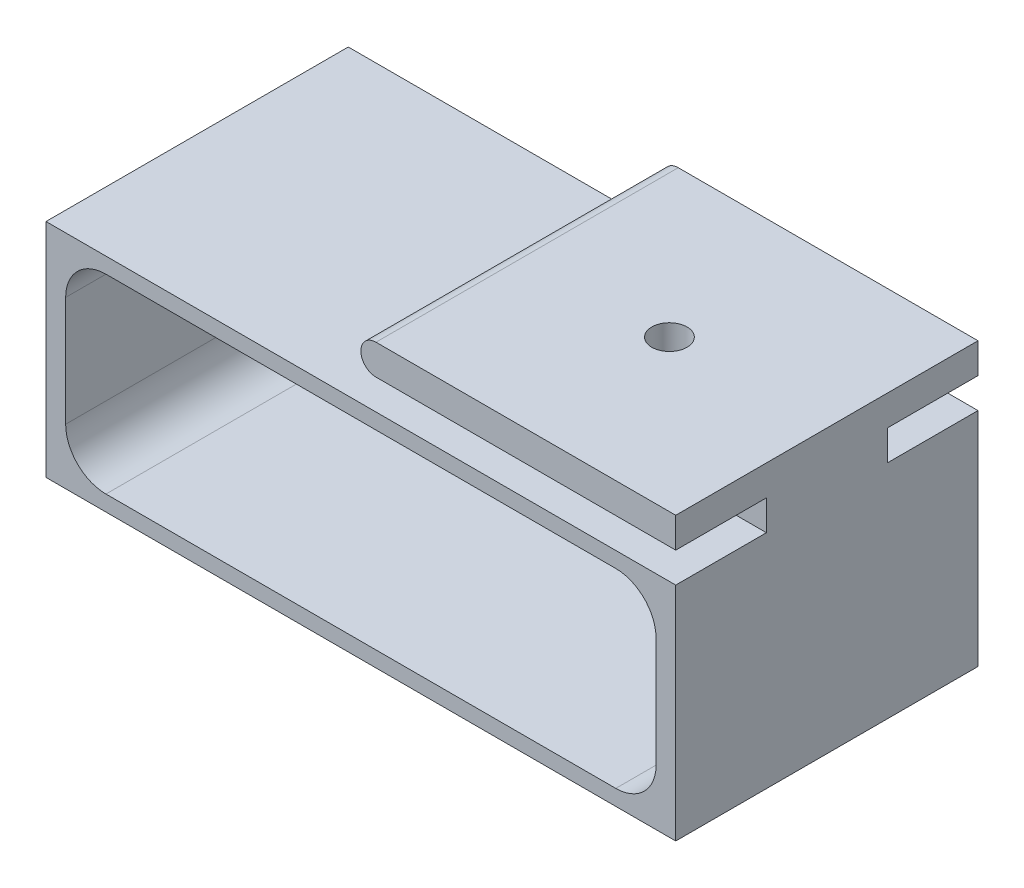
ISO-10303-21;
HEADER;
FILE_DESCRIPTION(('STEP AP214'),'2;1');
FILE_NAME('part.step','',(''),(''),'','','');
FILE_SCHEMA(('AUTOMOTIVE_DESIGN { 1 0 10303 214 1 1 1 1 }'));
ENDSEC;
DATA;
#1=APPLICATION_CONTEXT('core data for automotive mechanical design processes');
#2=APPLICATION_PROTOCOL_DEFINITION('international standard','automotive_design',2000,#1);
#3=PRODUCT_CONTEXT('',#1,'mechanical');
#4=PRODUCT('Part','Part','',(#3));
#5=PRODUCT_RELATED_PRODUCT_CATEGORY('part','',(#4));
#6=PRODUCT_DEFINITION_FORMATION('','',#4);
#7=PRODUCT_DEFINITION_CONTEXT('part definition',#1,'design');
#8=PRODUCT_DEFINITION('design','',#6,#7);
#9=PRODUCT_DEFINITION_SHAPE('','',#8);
#10=(LENGTH_UNIT() NAMED_UNIT(*) SI_UNIT(.MILLI.,.METRE.));
#11=(NAMED_UNIT(*) PLANE_ANGLE_UNIT() SI_UNIT($,.RADIAN.));
#12=(NAMED_UNIT(*) SI_UNIT($,.STERADIAN.) SOLID_ANGLE_UNIT());
#13=UNCERTAINTY_MEASURE_WITH_UNIT(LENGTH_MEASURE(1.E-05),#10,'distance_accuracy_value','');
#14=(GEOMETRIC_REPRESENTATION_CONTEXT(3) GLOBAL_UNCERTAINTY_ASSIGNED_CONTEXT((#13)) GLOBAL_UNIT_ASSIGNED_CONTEXT((#10,
#11,#12)) REPRESENTATION_CONTEXT('',''));
#15=CARTESIAN_POINT('',(0.,0.,0.));
#16=DIRECTION('',(0.,0.,1.));
#17=DIRECTION('',(1.,0.,0.));
#18=AXIS2_PLACEMENT_3D('',#15,#16,#17);
#19=CARTESIAN_POINT('',(0.,22.,15.));
#20=DIRECTION('',(0.,-1.,0.));
#21=DIRECTION('',(0.,0.,-1.));
#22=AXIS2_PLACEMENT_3D('',#19,#20,#21);
#23=PLANE('',#22);
#24=DIRECTION('',(-1.,0.,0.));
#25=VECTOR('',#24,1.);
#26=CARTESIAN_POINT('',(93.0941170815567,22.,-6.));
#27=LINE('',#26,#25);
#28=CARTESIAN_POINT('',(62.5,22.,-6.));
#29=VERTEX_POINT('',#28);
#30=CARTESIAN_POINT('',(31.25,22.,-6.));
#31=VERTEX_POINT('',#30);
#32=EDGE_CURVE('E246',#29,#31,#27,.T.);
#33=ORIENTED_EDGE('',*,*,#32,.F.);
#34=DIRECTION('',(0.,0.,-1.));
#35=VECTOR('',#34,1.);
#36=CARTESIAN_POINT('',(62.5,22.,15.));
#37=LINE('',#36,#35);
#38=CARTESIAN_POINT('',(62.5,22.,-15.));
#39=VERTEX_POINT('',#38);
#40=EDGE_CURVE('E317',#29,#39,#37,.T.);
#41=ORIENTED_EDGE('',*,*,#40,.T.);
#42=DIRECTION('',(-1.,0.,0.));
#43=VECTOR('',#42,1.);
#44=CARTESIAN_POINT('',(0.,22.,-15.));
#45=LINE('',#44,#43);
#46=CARTESIAN_POINT('',(0.,22.,-15.));
#47=VERTEX_POINT('',#46);
#48=EDGE_CURVE('E292',#39,#47,#45,.T.);
#49=ORIENTED_EDGE('',*,*,#48,.T.);
#50=DIRECTION('',(0.,0.,-1.));
#51=VECTOR('',#50,1.);
#52=CARTESIAN_POINT('',(0.,22.,15.));
#53=LINE('',#52,#51);
#54=CARTESIAN_POINT('',(0.,22.,15.));
#55=VERTEX_POINT('',#54);
#56=EDGE_CURVE('E301',#55,#47,#53,.T.);
#57=ORIENTED_EDGE('',*,*,#56,.F.);
#58=DIRECTION('',(-1.,0.,0.));
#59=VECTOR('',#58,1.);
#60=CARTESIAN_POINT('',(0.,22.,15.));
#61=LINE('',#60,#59);
#62=CARTESIAN_POINT('',(62.5,22.,15.));
#63=VERTEX_POINT('',#62);
#64=EDGE_CURVE('E298',#63,#55,#61,.T.);
#65=ORIENTED_EDGE('',*,*,#64,.F.);
#66=CARTESIAN_POINT('',(62.5,22.,6.));
#67=VERTEX_POINT('',#66);
#68=EDGE_CURVE('E221',#63,#67,#37,.T.);
#69=ORIENTED_EDGE('',*,*,#68,.T.);
#70=DIRECTION('',(-1.,0.,0.));
#71=VECTOR('',#70,1.);
#72=CARTESIAN_POINT('',(93.0941170815567,22.,6.));
#73=LINE('',#72,#71);
#74=CARTESIAN_POINT('',(31.25,22.,6.));
#75=VERTEX_POINT('',#74);
#76=EDGE_CURVE('E200',#67,#75,#73,.T.);
#77=ORIENTED_EDGE('',*,*,#76,.T.);
#78=DIRECTION('',(0.,0.,-1.));
#79=VECTOR('',#78,1.);
#80=CARTESIAN_POINT('',(31.25,22.,-6.));
#81=LINE('',#80,#79);
#82=EDGE_CURVE('E211',#75,#31,#81,.T.);
#83=ORIENTED_EDGE('',*,*,#82,.T.);
#84=EDGE_LOOP('',(#33,#41,#49,#57,#65,#69,#77,#83));
#85=FACE_BOUND('',#84,.T.);
#86=ADVANCED_FACE('F41',(#85),#23,.F.);
#87=CARTESIAN_POINT('',(0.,0.,15.));
#88=DIRECTION('',(0.,0.,-1.));
#89=DIRECTION('',(-1.,0.,0.));
#90=AXIS2_PLACEMENT_3D('',#87,#88,#89);
#91=PLANE('',#90);
#92=DIRECTION('',(0.,-1.,0.));
#93=VECTOR('',#92,1.);
#94=CARTESIAN_POINT('',(0.,0.,15.));
#95=LINE('',#94,#93);
#96=CARTESIAN_POINT('',(0.,0.,15.));
#97=VERTEX_POINT('',#96);
#98=EDGE_CURVE('E287',#55,#97,#95,.T.);
#99=ORIENTED_EDGE('',*,*,#98,.T.);
#100=DIRECTION('',(1.,0.,0.));
#101=VECTOR('',#100,1.);
#102=CARTESIAN_POINT('',(0.,0.,15.));
#103=LINE('',#102,#101);
#104=CARTESIAN_POINT('',(62.5,0.,15.));
#105=VERTEX_POINT('',#104);
#106=EDGE_CURVE('E291',#97,#105,#103,.T.);
#107=ORIENTED_EDGE('',*,*,#106,.T.);
#108=DIRECTION('',(0.,1.,0.));
#109=VECTOR('',#108,1.);
#110=CARTESIAN_POINT('',(62.5,0.,15.));
#111=LINE('',#110,#109);
#112=EDGE_CURVE('E295',#105,#63,#111,.T.);
#113=ORIENTED_EDGE('',*,*,#112,.T.);
#114=ORIENTED_EDGE('',*,*,#64,.T.);
#115=EDGE_LOOP('',(#99,#107,#113,#114));
#116=FACE_BOUND('',#115,.T.);
#117=DIRECTION('',(0.,-1.,0.));
#118=VECTOR('',#117,1.);
#119=CARTESIAN_POINT('',(1.95,1.55,15.));
#120=LINE('',#119,#118);
#121=CARTESIAN_POINT('',(1.95,16.45,15.));
#122=VERTEX_POINT('',#121);
#123=CARTESIAN_POINT('',(1.95,5.55,15.));
#124=VERTEX_POINT('',#123);
#125=EDGE_CURVE('E253',#122,#124,#120,.T.);
#126=ORIENTED_EDGE('',*,*,#125,.F.);
#127=CARTESIAN_POINT('',(5.95,16.45,15.));
#128=DIRECTION('',(0.,0.,-1.));
#129=DIRECTION('',(-1.,0.,0.));
#130=AXIS2_PLACEMENT_3D('',#127,#128,#129);
#131=CIRCLE('',#130,4.);
#132=CARTESIAN_POINT('',(5.95,20.45,15.));
#133=VERTEX_POINT('',#132);
#134=EDGE_CURVE('E365',#122,#133,#131,.T.);
#135=ORIENTED_EDGE('',*,*,#134,.T.);
#136=DIRECTION('',(-1.,0.,0.));
#137=VECTOR('',#136,1.);
#138=CARTESIAN_POINT('',(1.95,20.45,15.));
#139=LINE('',#138,#137);
#140=CARTESIAN_POINT('',(56.55,20.45,15.));
#141=VERTEX_POINT('',#140);
#142=EDGE_CURVE('E266',#141,#133,#139,.T.);
#143=ORIENTED_EDGE('',*,*,#142,.F.);
#144=CARTESIAN_POINT('',(56.55,16.45,15.));
#145=DIRECTION('',(0.,0.,-1.));
#146=DIRECTION('',(-1.,0.,0.));
#147=AXIS2_PLACEMENT_3D('',#144,#145,#146);
#148=CIRCLE('',#147,4.);
#149=CARTESIAN_POINT('',(60.55,16.45,15.));
#150=VERTEX_POINT('',#149);
#151=EDGE_CURVE('E359',#141,#150,#148,.T.);
#152=ORIENTED_EDGE('',*,*,#151,.T.);
#153=DIRECTION('',(0.,1.,0.));
#154=VECTOR('',#153,1.);
#155=CARTESIAN_POINT('',(60.55,1.55,15.));
#156=LINE('',#155,#154);
#157=CARTESIAN_POINT('',(60.55,5.55,15.));
#158=VERTEX_POINT('',#157);
#159=EDGE_CURVE('E262',#158,#150,#156,.T.);
#160=ORIENTED_EDGE('',*,*,#159,.F.);
#161=CARTESIAN_POINT('',(56.55,5.55,15.));
#162=DIRECTION('',(0.,0.,-1.));
#163=DIRECTION('',(-1.,0.,0.));
#164=AXIS2_PLACEMENT_3D('',#161,#162,#163);
#165=CIRCLE('',#164,4.);
#166=CARTESIAN_POINT('',(56.55,1.55,15.));
#167=VERTEX_POINT('',#166);
#168=EDGE_CURVE('E377',#158,#167,#165,.T.);
#169=ORIENTED_EDGE('',*,*,#168,.T.);
#170=DIRECTION('',(1.,0.,0.));
#171=VECTOR('',#170,1.);
#172=CARTESIAN_POINT('',(1.95,1.55,15.));
#173=LINE('',#172,#171);
#174=CARTESIAN_POINT('',(5.95,1.55,15.));
#175=VERTEX_POINT('',#174);
#176=EDGE_CURVE('E257',#175,#167,#173,.T.);
#177=ORIENTED_EDGE('',*,*,#176,.F.);
#178=CARTESIAN_POINT('',(5.95,5.55,15.));
#179=DIRECTION('',(0.,0.,-1.));
#180=DIRECTION('',(-1.,0.,0.));
#181=AXIS2_PLACEMENT_3D('',#178,#179,#180);
#182=CIRCLE('',#181,4.);
#183=EDGE_CURVE('E371',#175,#124,#182,.T.);
#184=ORIENTED_EDGE('',*,*,#183,.T.);
#185=EDGE_LOOP('',(#126,#135,#143,#152,#160,#169,#177,#184));
#186=FACE_BOUND('',#185,.T.);
#187=ADVANCED_FACE('F477',(#116,#186),#91,.F.);
#188=CARTESIAN_POINT('',(0.,0.,-15.));
#189=DIRECTION('',(0.,0.,-1.));
#190=DIRECTION('',(-1.,0.,0.));
#191=AXIS2_PLACEMENT_3D('',#188,#189,#190);
#192=PLANE('',#191);
#193=DIRECTION('',(0.,-1.,0.));
#194=VECTOR('',#193,1.);
#195=CARTESIAN_POINT('',(0.,0.,-15.));
#196=LINE('',#195,#194);
#197=CARTESIAN_POINT('',(0.,0.,-15.));
#198=VERTEX_POINT('',#197);
#199=EDGE_CURVE('E270',#47,#198,#196,.T.);
#200=ORIENTED_EDGE('',*,*,#199,.F.);
#201=ORIENTED_EDGE('',*,*,#48,.F.);
#202=DIRECTION('',(0.,1.,0.));
#203=VECTOR('',#202,1.);
#204=CARTESIAN_POINT('',(62.5,0.,-15.));
#205=LINE('',#204,#203);
#206=CARTESIAN_POINT('',(62.5,0.,-15.));
#207=VERTEX_POINT('',#206);
#208=EDGE_CURVE('E308',#207,#39,#205,.T.);
#209=ORIENTED_EDGE('',*,*,#208,.F.);
#210=DIRECTION('',(1.,0.,0.));
#211=VECTOR('',#210,1.);
#212=CARTESIAN_POINT('',(0.,0.,-15.));
#213=LINE('',#212,#211);
#214=EDGE_CURVE('E305',#198,#207,#213,.T.);
#215=ORIENTED_EDGE('',*,*,#214,.F.);
#216=EDGE_LOOP('',(#200,#201,#209,#215));
#217=FACE_BOUND('',#216,.T.);
#218=DIRECTION('',(0.,1.,0.));
#219=VECTOR('',#218,1.);
#220=CARTESIAN_POINT('',(60.55,1.55,-15.));
#221=LINE('',#220,#219);
#222=CARTESIAN_POINT('',(60.55,5.55,-15.));
#223=VERTEX_POINT('',#222);
#224=CARTESIAN_POINT('',(60.55,16.45,-15.));
#225=VERTEX_POINT('',#224);
#226=EDGE_CURVE('E280',#223,#225,#221,.T.);
#227=ORIENTED_EDGE('',*,*,#226,.T.);
#228=CARTESIAN_POINT('',(56.55,16.45,-15.));
#229=DIRECTION('',(0.,0.,-1.));
#230=DIRECTION('',(-1.,0.,0.));
#231=AXIS2_PLACEMENT_3D('',#228,#229,#230);
#232=CIRCLE('',#231,4.);
#233=CARTESIAN_POINT('',(56.55,20.45,-15.));
#234=VERTEX_POINT('',#233);
#235=EDGE_CURVE('E356',#225,#234,#232,.F.);
#236=ORIENTED_EDGE('',*,*,#235,.T.);
#237=DIRECTION('',(-1.,0.,0.));
#238=VECTOR('',#237,1.);
#239=CARTESIAN_POINT('',(1.95,20.45,-15.));
#240=LINE('',#239,#238);
#241=CARTESIAN_POINT('',(5.95,20.45,-15.));
#242=VERTEX_POINT('',#241);
#243=EDGE_CURVE('E258',#234,#242,#240,.T.);
#244=ORIENTED_EDGE('',*,*,#243,.T.);
#245=CARTESIAN_POINT('',(5.95,16.45,-15.));
#246=DIRECTION('',(0.,0.,-1.));
#247=DIRECTION('',(-1.,0.,0.));
#248=AXIS2_PLACEMENT_3D('',#245,#246,#247);
#249=CIRCLE('',#248,4.);
#250=CARTESIAN_POINT('',(1.95,16.45,-15.));
#251=VERTEX_POINT('',#250);
#252=EDGE_CURVE('E362',#242,#251,#249,.F.);
#253=ORIENTED_EDGE('',*,*,#252,.T.);
#254=DIRECTION('',(0.,-1.,0.));
#255=VECTOR('',#254,1.);
#256=CARTESIAN_POINT('',(1.95,1.55,-15.));
#257=LINE('',#256,#255);
#258=CARTESIAN_POINT('',(1.95,5.55,-15.));
#259=VERTEX_POINT('',#258);
#260=EDGE_CURVE('E271',#251,#259,#257,.T.);
#261=ORIENTED_EDGE('',*,*,#260,.T.);
#262=CARTESIAN_POINT('',(5.95,5.55,-15.));
#263=DIRECTION('',(0.,0.,-1.));
#264=DIRECTION('',(-1.,0.,0.));
#265=AXIS2_PLACEMENT_3D('',#262,#263,#264);
#266=CIRCLE('',#265,4.);
#267=CARTESIAN_POINT('',(5.95,1.55,-15.));
#268=VERTEX_POINT('',#267);
#269=EDGE_CURVE('E368',#259,#268,#266,.F.);
#270=ORIENTED_EDGE('',*,*,#269,.T.);
#271=DIRECTION('',(1.,0.,0.));
#272=VECTOR('',#271,1.);
#273=CARTESIAN_POINT('',(1.95,1.55,-15.));
#274=LINE('',#273,#272);
#275=CARTESIAN_POINT('',(56.55,1.55,-15.));
#276=VERTEX_POINT('',#275);
#277=EDGE_CURVE('E275',#268,#276,#274,.T.);
#278=ORIENTED_EDGE('',*,*,#277,.T.);
#279=CARTESIAN_POINT('',(56.55,5.55,-15.));
#280=DIRECTION('',(0.,0.,-1.));
#281=DIRECTION('',(-1.,0.,0.));
#282=AXIS2_PLACEMENT_3D('',#279,#280,#281);
#283=CIRCLE('',#282,4.);
#284=EDGE_CURVE('E374',#276,#223,#283,.F.);
#285=ORIENTED_EDGE('',*,*,#284,.T.);
#286=EDGE_LOOP('',(#227,#236,#244,#253,#261,#270,#278,#285));
#287=FACE_BOUND('',#286,.T.);
#288=ADVANCED_FACE('F470',(#217,#287),#192,.T.);
#289=CARTESIAN_POINT('',(0.,0.,15.));
#290=DIRECTION('',(1.,0.,0.));
#291=DIRECTION('',(0.,0.,-1.));
#292=AXIS2_PLACEMENT_3D('',#289,#290,#291);
#293=PLANE('',#292);
#294=ORIENTED_EDGE('',*,*,#199,.T.);
#295=DIRECTION('',(0.,0.,-1.));
#296=VECTOR('',#295,1.);
#297=CARTESIAN_POINT('',(0.,0.,15.));
#298=LINE('',#297,#296);
#299=EDGE_CURVE('E324',#97,#198,#298,.T.);
#300=ORIENTED_EDGE('',*,*,#299,.F.);
#301=ORIENTED_EDGE('',*,*,#98,.F.);
#302=ORIENTED_EDGE('',*,*,#56,.T.);
#303=EDGE_LOOP('',(#294,#300,#301,#302));
#304=FACE_BOUND('',#303,.T.);
#305=ADVANCED_FACE('F474',(#304),#293,.F.);
#306=CARTESIAN_POINT('',(0.,0.,15.));
#307=DIRECTION('',(0.,1.,0.));
#308=DIRECTION('',(-1.,0.,0.));
#309=AXIS2_PLACEMENT_3D('',#306,#307,#308);
#310=PLANE('',#309);
#311=ORIENTED_EDGE('',*,*,#214,.T.);
#312=DIRECTION('',(0.,0.,-1.));
#313=VECTOR('',#312,1.);
#314=CARTESIAN_POINT('',(62.5,0.,15.));
#315=LINE('',#314,#313);
#316=EDGE_CURVE('E320',#105,#207,#315,.T.);
#317=ORIENTED_EDGE('',*,*,#316,.F.);
#318=ORIENTED_EDGE('',*,*,#106,.F.);
#319=ORIENTED_EDGE('',*,*,#299,.T.);
#320=EDGE_LOOP('',(#311,#317,#318,#319));
#321=FACE_BOUND('',#320,.T.);
#322=ADVANCED_FACE('F506',(#321),#310,.F.);
#323=CARTESIAN_POINT('',(62.5,0.,15.));
#324=DIRECTION('',(-1.,0.,0.));
#325=DIRECTION('',(0.,0.,1.));
#326=AXIS2_PLACEMENT_3D('',#323,#324,#325);
#327=PLANE('',#326);
#328=ORIENTED_EDGE('',*,*,#208,.T.);
#329=ORIENTED_EDGE('',*,*,#40,.F.);
#330=DIRECTION('',(0.,-1.,0.));
#331=VECTOR('',#330,1.);
#332=CARTESIAN_POINT('',(62.5,25.,-6.));
#333=LINE('',#332,#331);
#334=CARTESIAN_POINT('',(62.5,25.,-6.));
#335=VERTEX_POINT('',#334);
#336=EDGE_CURVE('E276',#335,#29,#333,.T.);
#337=ORIENTED_EDGE('',*,*,#336,.F.);
#338=DIRECTION('',(0.,0.,1.));
#339=VECTOR('',#338,1.);
#340=CARTESIAN_POINT('',(62.5,25.,-15.));
#341=LINE('',#340,#339);
#342=CARTESIAN_POINT('',(62.5,25.,-15.));
#343=VERTEX_POINT('',#342);
#344=EDGE_CURVE('E440',#343,#335,#341,.T.);
#345=ORIENTED_EDGE('',*,*,#344,.F.);
#346=DIRECTION('',(0.,-1.,0.));
#347=VECTOR('',#346,1.);
#348=CARTESIAN_POINT('',(62.5,28.,-15.));
#349=LINE('',#348,#347);
#350=CARTESIAN_POINT('',(62.5,28.,-15.));
#351=VERTEX_POINT('',#350);
#352=EDGE_CURVE('E436',#351,#343,#349,.T.);
#353=ORIENTED_EDGE('',*,*,#352,.F.);
#354=DIRECTION('',(0.,0.,-1.));
#355=VECTOR('',#354,1.);
#356=CARTESIAN_POINT('',(62.5,28.,15.));
#357=LINE('',#356,#355);
#358=CARTESIAN_POINT('',(62.5,28.,15.));
#359=VERTEX_POINT('',#358);
#360=EDGE_CURVE('E432',#359,#351,#357,.T.);
#361=ORIENTED_EDGE('',*,*,#360,.F.);
#362=DIRECTION('',(0.,1.,0.));
#363=VECTOR('',#362,1.);
#364=CARTESIAN_POINT('',(62.5,25.,15.));
#365=LINE('',#364,#363);
#366=CARTESIAN_POINT('',(62.5,25.,15.));
#367=VERTEX_POINT('',#366);
#368=EDGE_CURVE('E428',#367,#359,#365,.T.);
#369=ORIENTED_EDGE('',*,*,#368,.F.);
#370=DIRECTION('',(0.,0.,1.));
#371=VECTOR('',#370,1.);
#372=CARTESIAN_POINT('',(62.5,25.,6.));
#373=LINE('',#372,#371);
#374=CARTESIAN_POINT('',(62.5,25.,6.));
#375=VERTEX_POINT('',#374);
#376=EDGE_CURVE('E252',#375,#367,#373,.T.);
#377=ORIENTED_EDGE('',*,*,#376,.F.);
#378=DIRECTION('',(0.,1.,0.));
#379=VECTOR('',#378,1.);
#380=CARTESIAN_POINT('',(62.5,22.,6.));
#381=LINE('',#380,#379);
#382=EDGE_CURVE('E249',#67,#375,#381,.T.);
#383=ORIENTED_EDGE('',*,*,#382,.F.);
#384=ORIENTED_EDGE('',*,*,#68,.F.);
#385=ORIENTED_EDGE('',*,*,#112,.F.);
#386=ORIENTED_EDGE('',*,*,#316,.T.);
#387=EDGE_LOOP('',(#328,#329,#337,#345,#353,#361,#369,#377,#383,#384,#385,#386));
#388=FACE_BOUND('',#387,.T.);
#389=ADVANCED_FACE('F460',(#388),#327,.F.);
#390=CARTESIAN_POINT('',(1.95,1.55,15.));
#391=DIRECTION('',(1.,0.,0.));
#392=DIRECTION('',(0.,0.,-1.));
#393=AXIS2_PLACEMENT_3D('',#390,#391,#392);
#394=PLANE('',#393);
#395=ORIENTED_EDGE('',*,*,#260,.F.);
#396=DIRECTION('',(0.,0.,-1.));
#397=VECTOR('',#396,1.);
#398=CARTESIAN_POINT('',(1.95,16.45,15.));
#399=LINE('',#398,#397);
#400=EDGE_CURVE('E346',#251,#122,#399,.F.);
#401=ORIENTED_EDGE('',*,*,#400,.T.);
#402=ORIENTED_EDGE('',*,*,#125,.T.);
#403=DIRECTION('',(0.,0.,-1.));
#404=VECTOR('',#403,1.);
#405=CARTESIAN_POINT('',(1.95,5.55,-15.));
#406=LINE('',#405,#404);
#407=EDGE_CURVE('E342',#124,#259,#406,.T.);
#408=ORIENTED_EDGE('',*,*,#407,.T.);
#409=EDGE_LOOP('',(#395,#401,#402,#408));
#410=FACE_BOUND('',#409,.T.);
#411=ADVANCED_FACE('F505',(#410),#394,.T.);
#412=CARTESIAN_POINT('',(1.95,1.55,15.));
#413=DIRECTION('',(0.,1.,0.));
#414=DIRECTION('',(0.,0.,1.));
#415=AXIS2_PLACEMENT_3D('',#412,#413,#414);
#416=PLANE('',#415);
#417=ORIENTED_EDGE('',*,*,#277,.F.);
#418=DIRECTION('',(0.,0.,-1.));
#419=VECTOR('',#418,1.);
#420=CARTESIAN_POINT('',(5.95,1.55,15.));
#421=LINE('',#420,#419);
#422=EDGE_CURVE('E353',#268,#175,#421,.F.);
#423=ORIENTED_EDGE('',*,*,#422,.T.);
#424=ORIENTED_EDGE('',*,*,#176,.T.);
#425=DIRECTION('',(0.,0.,-1.));
#426=VECTOR('',#425,1.);
#427=CARTESIAN_POINT('',(56.55,1.55,-15.));
#428=LINE('',#427,#426);
#429=EDGE_CURVE('E349',#167,#276,#428,.T.);
#430=ORIENTED_EDGE('',*,*,#429,.T.);
#431=EDGE_LOOP('',(#417,#423,#424,#430));
#432=FACE_BOUND('',#431,.T.);
#433=ADVANCED_FACE('F637',(#432),#416,.T.);
#434=CARTESIAN_POINT('',(60.55,1.55,15.));
#435=DIRECTION('',(-1.,0.,0.));
#436=DIRECTION('',(0.,0.,1.));
#437=AXIS2_PLACEMENT_3D('',#434,#435,#436);
#438=PLANE('',#437);
#439=ORIENTED_EDGE('',*,*,#159,.T.);
#440=DIRECTION('',(0.,0.,-1.));
#441=VECTOR('',#440,1.);
#442=CARTESIAN_POINT('',(60.55,16.45,-15.));
#443=LINE('',#442,#441);
#444=EDGE_CURVE('E331',#150,#225,#443,.T.);
#445=ORIENTED_EDGE('',*,*,#444,.T.);
#446=ORIENTED_EDGE('',*,*,#226,.F.);
#447=DIRECTION('',(0.,0.,-1.));
#448=VECTOR('',#447,1.);
#449=CARTESIAN_POINT('',(60.55,5.55,15.));
#450=LINE('',#449,#448);
#451=EDGE_CURVE('E328',#223,#158,#450,.F.);
#452=ORIENTED_EDGE('',*,*,#451,.T.);
#453=EDGE_LOOP('',(#439,#445,#446,#452));
#454=FACE_BOUND('',#453,.T.);
#455=ADVANCED_FACE('F629',(#454),#438,.T.);
#456=CARTESIAN_POINT('',(1.95,20.45,15.));
#457=DIRECTION('',(0.,-1.,0.));
#458=DIRECTION('',(0.,0.,-1.));
#459=AXIS2_PLACEMENT_3D('',#456,#457,#458);
#460=PLANE('',#459);
#461=ORIENTED_EDGE('',*,*,#243,.F.);
#462=DIRECTION('',(0.,0.,-1.));
#463=VECTOR('',#462,1.);
#464=CARTESIAN_POINT('',(56.55,20.45,15.));
#465=LINE('',#464,#463);
#466=EDGE_CURVE('E339',#234,#141,#465,.F.);
#467=ORIENTED_EDGE('',*,*,#466,.T.);
#468=ORIENTED_EDGE('',*,*,#142,.T.);
#469=DIRECTION('',(0.,0.,-1.));
#470=VECTOR('',#469,1.);
#471=CARTESIAN_POINT('',(5.95,20.45,-15.));
#472=LINE('',#471,#470);
#473=EDGE_CURVE('E335',#133,#242,#472,.T.);
#474=ORIENTED_EDGE('',*,*,#473,.T.);
#475=EDGE_LOOP('',(#461,#467,#468,#474));
#476=FACE_BOUND('',#475,.T.);
#477=ADVANCED_FACE('F620',(#476),#460,.T.);
#478=CARTESIAN_POINT('',(31.25,0.,0.));
#479=DIRECTION('',(-1.,0.,0.));
#480=DIRECTION('',(0.,0.,1.));
#481=AXIS2_PLACEMENT_3D('',#478,#479,#480);
#482=PLANE('',#481);
#483=DIRECTION('',(0.,0.,1.));
#484=VECTOR('',#483,1.);
#485=CARTESIAN_POINT('',(31.25,26.5,-15.));
#486=LINE('',#485,#484);
#487=CARTESIAN_POINT('',(31.25,26.5,6.));
#488=VERTEX_POINT('',#487);
#489=CARTESIAN_POINT('',(31.25,26.5,-6.));
#490=VERTEX_POINT('',#489);
#491=EDGE_CURVE('E390',#488,#490,#486,.F.);
#492=ORIENTED_EDGE('',*,*,#491,.T.);
#493=DIRECTION('',(0.,1.,0.));
#494=VECTOR('',#493,1.);
#495=CARTESIAN_POINT('',(31.25,25.,-6.));
#496=LINE('',#495,#494);
#497=EDGE_CURVE('E208',#31,#490,#496,.T.);
#498=ORIENTED_EDGE('',*,*,#497,.F.);
#499=ORIENTED_EDGE('',*,*,#82,.F.);
#500=DIRECTION('',(0.,-1.,0.));
#501=VECTOR('',#500,1.);
#502=CARTESIAN_POINT('',(31.25,22.,6.));
#503=LINE('',#502,#501);
#504=EDGE_CURVE('E195',#488,#75,#503,.T.);
#505=ORIENTED_EDGE('',*,*,#504,.F.);
#506=EDGE_LOOP('',(#492,#498,#499,#505));
#507=FACE_BOUND('',#506,.T.);
#508=ADVANCED_FACE('F212',(#507),#482,.T.);
#509=CARTESIAN_POINT('',(93.0941170815567,22.,6.));
#510=DIRECTION('',(0.,0.,-1.));
#511=DIRECTION('',(-1.,0.,0.));
#512=AXIS2_PLACEMENT_3D('',#509,#510,#511);
#513=PLANE('',#512);
#514=ORIENTED_EDGE('',*,*,#76,.F.);
#515=ORIENTED_EDGE('',*,*,#382,.T.);
#516=DIRECTION('',(-1.,0.,0.));
#517=VECTOR('',#516,1.);
#518=CARTESIAN_POINT('',(93.0941170815567,25.,6.));
#519=LINE('',#518,#517);
#520=CARTESIAN_POINT('',(32.75,25.,6.));
#521=VERTEX_POINT('',#520);
#522=EDGE_CURVE('E223',#375,#521,#519,.T.);
#523=ORIENTED_EDGE('',*,*,#522,.T.);
#524=CARTESIAN_POINT('',(32.75,26.5,6.));
#525=DIRECTION('',(0.,0.,-1.));
#526=DIRECTION('',(-1.,0.,0.));
#527=AXIS2_PLACEMENT_3D('',#524,#525,#526);
#528=CIRCLE('',#527,1.5);
#529=EDGE_CURVE('E11',#521,#488,#528,.T.);
#530=ORIENTED_EDGE('',*,*,#529,.T.);
#531=ORIENTED_EDGE('',*,*,#504,.T.);
#532=EDGE_LOOP('',(#514,#515,#523,#530,#531));
#533=FACE_BOUND('',#532,.T.);
#534=ADVANCED_FACE('F197',(#533),#513,.F.);
#535=CARTESIAN_POINT('',(93.0941170815567,25.,6.));
#536=DIRECTION('',(0.,1.,0.));
#537=DIRECTION('',(0.,0.,1.));
#538=AXIS2_PLACEMENT_3D('',#535,#536,#537);
#539=PLANE('',#538);
#540=DIRECTION('',(-1.,0.,0.));
#541=VECTOR('',#540,1.);
#542=CARTESIAN_POINT('',(93.0941170815567,25.,15.));
#543=LINE('',#542,#541);
#544=CARTESIAN_POINT('',(32.75,25.,15.));
#545=VERTEX_POINT('',#544);
#546=EDGE_CURVE('E226',#367,#545,#543,.T.);
#547=ORIENTED_EDGE('',*,*,#546,.T.);
#548=DIRECTION('',(0.,0.,-1.));
#549=VECTOR('',#548,1.);
#550=CARTESIAN_POINT('',(32.75,25.,6.));
#551=LINE('',#550,#549);
#552=EDGE_CURVE('E393',#545,#521,#551,.T.);
#553=ORIENTED_EDGE('',*,*,#552,.T.);
#554=ORIENTED_EDGE('',*,*,#522,.F.);
#555=ORIENTED_EDGE('',*,*,#376,.T.);
#556=EDGE_LOOP('',(#547,#553,#554,#555));
#557=FACE_BOUND('',#556,.T.);
#558=ADVANCED_FACE('F483',(#557),#539,.F.);
#559=CARTESIAN_POINT('',(93.0941170815567,25.,15.));
#560=DIRECTION('',(0.,0.,-1.));
#561=DIRECTION('',(-1.,0.,0.));
#562=AXIS2_PLACEMENT_3D('',#559,#560,#561);
#563=PLANE('',#562);
#564=CARTESIAN_POINT('',(32.75,26.5,15.));
#565=DIRECTION('',(0.,0.,-1.));
#566=DIRECTION('',(-1.,0.,0.));
#567=AXIS2_PLACEMENT_3D('',#564,#565,#566);
#568=CIRCLE('',#567,1.5);
#569=CARTESIAN_POINT('',(32.75,28.,15.));
#570=VERTEX_POINT('',#569);
#571=CARTESIAN_POINT('',(31.25,26.5,15.));
#572=VERTEX_POINT('',#571);
#573=EDGE_CURVE('E396',#570,#572,#568,.F.);
#574=ORIENTED_EDGE('',*,*,#573,.T.);
#575=CARTESIAN_POINT('',(32.75,26.5,15.));
#576=DIRECTION('',(0.,0.,-1.));
#577=DIRECTION('',(-1.,0.,0.));
#578=AXIS2_PLACEMENT_3D('',#575,#576,#577);
#579=CIRCLE('',#578,1.5);
#580=EDGE_CURVE('E67',#572,#545,#579,.F.);
#581=ORIENTED_EDGE('',*,*,#580,.T.);
#582=ORIENTED_EDGE('',*,*,#546,.F.);
#583=ORIENTED_EDGE('',*,*,#368,.T.);
#584=DIRECTION('',(-1.,0.,0.));
#585=VECTOR('',#584,1.);
#586=CARTESIAN_POINT('',(93.0941170815567,28.,15.));
#587=LINE('',#586,#585);
#588=EDGE_CURVE('E232',#359,#570,#587,.T.);
#589=ORIENTED_EDGE('',*,*,#588,.T.);
#590=EDGE_LOOP('',(#574,#581,#582,#583,#589));
#591=FACE_BOUND('',#590,.T.);
#592=ADVANCED_FACE('F484',(#591),#563,.F.);
#593=CARTESIAN_POINT('',(93.0941170815567,28.,15.));
#594=DIRECTION('',(0.,-1.,0.));
#595=DIRECTION('',(0.,0.,-1.));
#596=AXIS2_PLACEMENT_3D('',#593,#594,#595);
#597=PLANE('',#596);
#598=CARTESIAN_POINT('',(46.875,28.,0.));
#599=DIRECTION('',(0.,1.,0.));
#600=DIRECTION('',(0.,0.,1.));
#601=AXIS2_PLACEMENT_3D('',#598,#599,#600);
#602=CIRCLE('',#601,1.75);
#603=CARTESIAN_POINT('',(46.875,28.,1.75));
#604=VERTEX_POINT('',#603);
#605=EDGE_CURVE('E412',#604,#604,#602,.T.);
#606=ORIENTED_EDGE('',*,*,#605,.F.);
#607=EDGE_LOOP('',(#606));
#608=FACE_BOUND('',#607,.T.);
#609=DIRECTION('',(-1.,0.,0.));
#610=VECTOR('',#609,1.);
#611=CARTESIAN_POINT('',(93.0941170815567,28.,-15.));
#612=LINE('',#611,#610);
#613=CARTESIAN_POINT('',(32.75,28.,-15.));
#614=VERTEX_POINT('',#613);
#615=EDGE_CURVE('E235',#351,#614,#612,.T.);
#616=ORIENTED_EDGE('',*,*,#615,.T.);
#617=DIRECTION('',(0.,0.,1.));
#618=VECTOR('',#617,1.);
#619=CARTESIAN_POINT('',(32.75,28.,15.));
#620=LINE('',#619,#618);
#621=EDGE_CURVE('E59',#614,#570,#620,.T.);
#622=ORIENTED_EDGE('',*,*,#621,.T.);
#623=ORIENTED_EDGE('',*,*,#588,.F.);
#624=ORIENTED_EDGE('',*,*,#360,.T.);
#625=EDGE_LOOP('',(#616,#622,#623,#624));
#626=FACE_BOUND('',#625,.T.);
#627=ADVANCED_FACE('F485',(#608,#626),#597,.F.);
#628=CARTESIAN_POINT('',(93.0941170815567,28.,-15.));
#629=DIRECTION('',(0.,0.,1.));
#630=DIRECTION('',(0.,-1.,0.));
#631=AXIS2_PLACEMENT_3D('',#628,#629,#630);
#632=PLANE('',#631);
#633=DIRECTION('',(-1.,0.,0.));
#634=VECTOR('',#633,1.);
#635=CARTESIAN_POINT('',(93.0941170815567,25.,-15.));
#636=LINE('',#635,#634);
#637=CARTESIAN_POINT('',(32.75,25.,-15.));
#638=VERTEX_POINT('',#637);
#639=EDGE_CURVE('E238',#343,#638,#636,.T.);
#640=ORIENTED_EDGE('',*,*,#639,.T.);
#641=CARTESIAN_POINT('',(32.75,26.5,-15.));
#642=DIRECTION('',(0.,0.,1.));
#643=DIRECTION('',(0.,-1.,0.));
#644=AXIS2_PLACEMENT_3D('',#641,#642,#643);
#645=CIRCLE('',#644,1.5);
#646=CARTESIAN_POINT('',(31.25,26.5,-15.));
#647=VERTEX_POINT('',#646);
#648=EDGE_CURVE('E387',#638,#647,#645,.F.);
#649=ORIENTED_EDGE('',*,*,#648,.T.);
#650=CARTESIAN_POINT('',(32.75,26.5,-15.));
#651=DIRECTION('',(0.,0.,1.));
#652=DIRECTION('',(0.,-1.,0.));
#653=AXIS2_PLACEMENT_3D('',#650,#651,#652);
#654=CIRCLE('',#653,1.5);
#655=EDGE_CURVE('E384',#647,#614,#654,.F.);
#656=ORIENTED_EDGE('',*,*,#655,.T.);
#657=ORIENTED_EDGE('',*,*,#615,.F.);
#658=ORIENTED_EDGE('',*,*,#352,.T.);
#659=EDGE_LOOP('',(#640,#649,#656,#657,#658));
#660=FACE_BOUND('',#659,.T.);
#661=ADVANCED_FACE('F457',(#660),#632,.F.);
#662=CARTESIAN_POINT('',(93.0941170815567,25.,-15.));
#663=DIRECTION('',(0.,1.,0.));
#664=DIRECTION('',(0.,0.,1.));
#665=AXIS2_PLACEMENT_3D('',#662,#663,#664);
#666=PLANE('',#665);
#667=DIRECTION('',(-1.,0.,0.));
#668=VECTOR('',#667,1.);
#669=CARTESIAN_POINT('',(93.0941170815567,25.,-6.));
#670=LINE('',#669,#668);
#671=CARTESIAN_POINT('',(32.75,25.,-6.));
#672=VERTEX_POINT('',#671);
#673=EDGE_CURVE('E242',#335,#672,#670,.T.);
#674=ORIENTED_EDGE('',*,*,#673,.T.);
#675=DIRECTION('',(0.,0.,-1.));
#676=VECTOR('',#675,1.);
#677=CARTESIAN_POINT('',(32.75,25.,-15.));
#678=LINE('',#677,#676);
#679=EDGE_CURVE('E380',#672,#638,#678,.T.);
#680=ORIENTED_EDGE('',*,*,#679,.T.);
#681=ORIENTED_EDGE('',*,*,#639,.F.);
#682=ORIENTED_EDGE('',*,*,#344,.T.);
#683=EDGE_LOOP('',(#674,#680,#681,#682));
#684=FACE_BOUND('',#683,.T.);
#685=ADVANCED_FACE('F455',(#684),#666,.F.);
#686=CARTESIAN_POINT('',(93.0941170815567,25.,-6.));
#687=DIRECTION('',(0.,0.,1.));
#688=DIRECTION('',(0.,-1.,0.));
#689=AXIS2_PLACEMENT_3D('',#686,#687,#688);
#690=PLANE('',#689);
#691=ORIENTED_EDGE('',*,*,#673,.F.);
#692=ORIENTED_EDGE('',*,*,#336,.T.);
#693=ORIENTED_EDGE('',*,*,#32,.T.);
#694=ORIENTED_EDGE('',*,*,#497,.T.);
#695=CARTESIAN_POINT('',(32.75,26.5,-6.));
#696=DIRECTION('',(0.,0.,1.));
#697=DIRECTION('',(0.,-1.,0.));
#698=AXIS2_PLACEMENT_3D('',#695,#696,#697);
#699=CIRCLE('',#698,1.5);
#700=EDGE_CURVE('E51',#490,#672,#699,.T.);
#701=ORIENTED_EDGE('',*,*,#700,.T.);
#702=EDGE_LOOP('',(#691,#692,#693,#694,#701));
#703=FACE_BOUND('',#702,.T.);
#704=ADVANCED_FACE('F448',(#703),#690,.F.);
#705=CARTESIAN_POINT('',(46.875,25.,0.));
#706=DIRECTION('',(0.,1.,0.));
#707=DIRECTION('',(0.,0.,1.));
#708=AXIS2_PLACEMENT_3D('',#705,#706,#707);
#709=CYLINDRICAL_SURFACE('',#708,1.75);
#710=CARTESIAN_POINT('',(46.875,25.,0.));
#711=DIRECTION('',(0.,1.,0.));
#712=DIRECTION('',(0.,0.,1.));
#713=AXIS2_PLACEMENT_3D('',#710,#711,#712);
#714=CIRCLE('',#713,1.75);
#715=CARTESIAN_POINT('',(46.875,25.,1.75));
#716=VERTEX_POINT('',#715);
#717=EDGE_CURVE('E217',#716,#716,#714,.T.);
#718=ORIENTED_EDGE('',*,*,#717,.F.);
#719=EDGE_LOOP('',(#718));
#720=FACE_BOUND('',#719,.T.);
#721=ORIENTED_EDGE('',*,*,#605,.T.);
#722=EDGE_LOOP('',(#721));
#723=FACE_BOUND('',#722,.T.);
#724=ADVANCED_FACE('F561',(#720,#723),#709,.F.);
#725=CARTESIAN_POINT('',(46.875,25.,0.));
#726=DIRECTION('',(0.,1.,0.));
#727=DIRECTION('',(0.,0.,1.));
#728=AXIS2_PLACEMENT_3D('',#725,#726,#727);
#729=PLANE('',#728);
#730=ORIENTED_EDGE('',*,*,#717,.T.);
#731=EDGE_LOOP('',(#730));
#732=FACE_BOUND('',#731,.T.);
#733=ADVANCED_FACE('F516',(#732),#729,.T.);
#734=CARTESIAN_POINT('',(56.55,16.45,15.));
#735=DIRECTION('',(0.,0.,1.));
#736=DIRECTION('',(1.,0.,0.));
#737=AXIS2_PLACEMENT_3D('',#734,#735,#736);
#738=CYLINDRICAL_SURFACE('',#737,4.);
#739=ORIENTED_EDGE('',*,*,#151,.F.);
#740=ORIENTED_EDGE('',*,*,#466,.F.);
#741=ORIENTED_EDGE('',*,*,#235,.F.);
#742=ORIENTED_EDGE('',*,*,#444,.F.);
#743=EDGE_LOOP('',(#739,#740,#741,#742));
#744=FACE_BOUND('',#743,.T.);
#745=ADVANCED_FACE('F512',(#744),#738,.F.);
#746=CARTESIAN_POINT('',(5.95,16.45,15.));
#747=DIRECTION('',(0.,0.,1.));
#748=DIRECTION('',(1.,0.,0.));
#749=AXIS2_PLACEMENT_3D('',#746,#747,#748);
#750=CYLINDRICAL_SURFACE('',#749,4.);
#751=ORIENTED_EDGE('',*,*,#134,.F.);
#752=ORIENTED_EDGE('',*,*,#400,.F.);
#753=ORIENTED_EDGE('',*,*,#252,.F.);
#754=ORIENTED_EDGE('',*,*,#473,.F.);
#755=EDGE_LOOP('',(#751,#752,#753,#754));
#756=FACE_BOUND('',#755,.T.);
#757=ADVANCED_FACE('F515',(#756),#750,.F.);
#758=CARTESIAN_POINT('',(5.95,5.55,15.));
#759=DIRECTION('',(0.,0.,1.));
#760=DIRECTION('',(1.,0.,0.));
#761=AXIS2_PLACEMENT_3D('',#758,#759,#760);
#762=CYLINDRICAL_SURFACE('',#761,4.);
#763=ORIENTED_EDGE('',*,*,#183,.F.);
#764=ORIENTED_EDGE('',*,*,#422,.F.);
#765=ORIENTED_EDGE('',*,*,#269,.F.);
#766=ORIENTED_EDGE('',*,*,#407,.F.);
#767=EDGE_LOOP('',(#763,#764,#765,#766));
#768=FACE_BOUND('',#767,.T.);
#769=ADVANCED_FACE('F520',(#768),#762,.F.);
#770=CARTESIAN_POINT('',(56.55,5.55,15.));
#771=DIRECTION('',(0.,0.,1.));
#772=DIRECTION('',(1.,0.,0.));
#773=AXIS2_PLACEMENT_3D('',#770,#771,#772);
#774=CYLINDRICAL_SURFACE('',#773,4.);
#775=ORIENTED_EDGE('',*,*,#168,.F.);
#776=ORIENTED_EDGE('',*,*,#451,.F.);
#777=ORIENTED_EDGE('',*,*,#284,.F.);
#778=ORIENTED_EDGE('',*,*,#429,.F.);
#779=EDGE_LOOP('',(#775,#776,#777,#778));
#780=FACE_BOUND('',#779,.T.);
#781=ADVANCED_FACE('F524',(#780),#774,.F.);
#782=CARTESIAN_POINT('',(32.75,26.5,6.));
#783=DIRECTION('',(0.,0.,1.));
#784=DIRECTION('',(1.,0.,0.));
#785=AXIS2_PLACEMENT_3D('',#782,#783,#784);
#786=CYLINDRICAL_SURFACE('',#785,1.5);
#787=ORIENTED_EDGE('',*,*,#552,.F.);
#788=ORIENTED_EDGE('',*,*,#580,.F.);
#789=DIRECTION('',(0.,0.,-1.));
#790=VECTOR('',#789,1.);
#791=CARTESIAN_POINT('',(31.25,26.5,15.));
#792=LINE('',#791,#790);
#793=EDGE_CURVE('E45',#488,#572,#792,.F.);
#794=ORIENTED_EDGE('',*,*,#793,.F.);
#795=ORIENTED_EDGE('',*,*,#529,.F.);
#796=EDGE_LOOP('',(#787,#788,#794,#795));
#797=FACE_BOUND('',#796,.T.);
#798=ADVANCED_FACE('F43',(#797),#786,.T.);
#799=CARTESIAN_POINT('',(32.75,26.5,15.));
#800=DIRECTION('',(0.,0.,-1.));
#801=DIRECTION('',(-1.,0.,0.));
#802=AXIS2_PLACEMENT_3D('',#799,#800,#801);
#803=CYLINDRICAL_SURFACE('',#802,1.5);
#804=DIRECTION('',(0.,0.,1.));
#805=VECTOR('',#804,1.);
#806=CARTESIAN_POINT('',(31.25,26.5,-15.));
#807=LINE('',#806,#805);
#808=EDGE_CURVE('E404',#490,#647,#807,.F.);
#809=ORIENTED_EDGE('',*,*,#808,.F.);
#810=ORIENTED_EDGE('',*,*,#491,.F.);
#811=ORIENTED_EDGE('',*,*,#793,.T.);
#812=ORIENTED_EDGE('',*,*,#573,.F.);
#813=ORIENTED_EDGE('',*,*,#621,.F.);
#814=ORIENTED_EDGE('',*,*,#655,.F.);
#815=EDGE_LOOP('',(#809,#810,#811,#812,#813,#814));
#816=FACE_BOUND('',#815,.T.);
#817=ADVANCED_FACE('F450',(#816),#803,.T.);
#818=CARTESIAN_POINT('',(32.75,26.5,-15.));
#819=DIRECTION('',(0.,0.,1.));
#820=DIRECTION('',(0.,-1.,0.));
#821=AXIS2_PLACEMENT_3D('',#818,#819,#820);
#822=CYLINDRICAL_SURFACE('',#821,1.5);
#823=ORIENTED_EDGE('',*,*,#700,.F.);
#824=ORIENTED_EDGE('',*,*,#808,.T.);
#825=ORIENTED_EDGE('',*,*,#648,.F.);
#826=ORIENTED_EDGE('',*,*,#679,.F.);
#827=EDGE_LOOP('',(#823,#824,#825,#826));
#828=FACE_BOUND('',#827,.T.);
#829=ADVANCED_FACE('F452',(#828),#822,.T.);
#830=CLOSED_SHELL('',(#86,#187,#288,#305,#322,#389,#411,#433,#455,#477,#508,#534,#558,#592,#627,
#661,#685,#704,#724,#733,#745,#757,#769,#781,#798,#817,#829));
#831=MANIFOLD_SOLID_BREP('B2',#830);
#832=ADVANCED_BREP_SHAPE_REPRESENTATION('',(#18,#831),#14);
#833=SHAPE_DEFINITION_REPRESENTATION(#9,#832);
ENDSEC;
END-ISO-10303-21;
